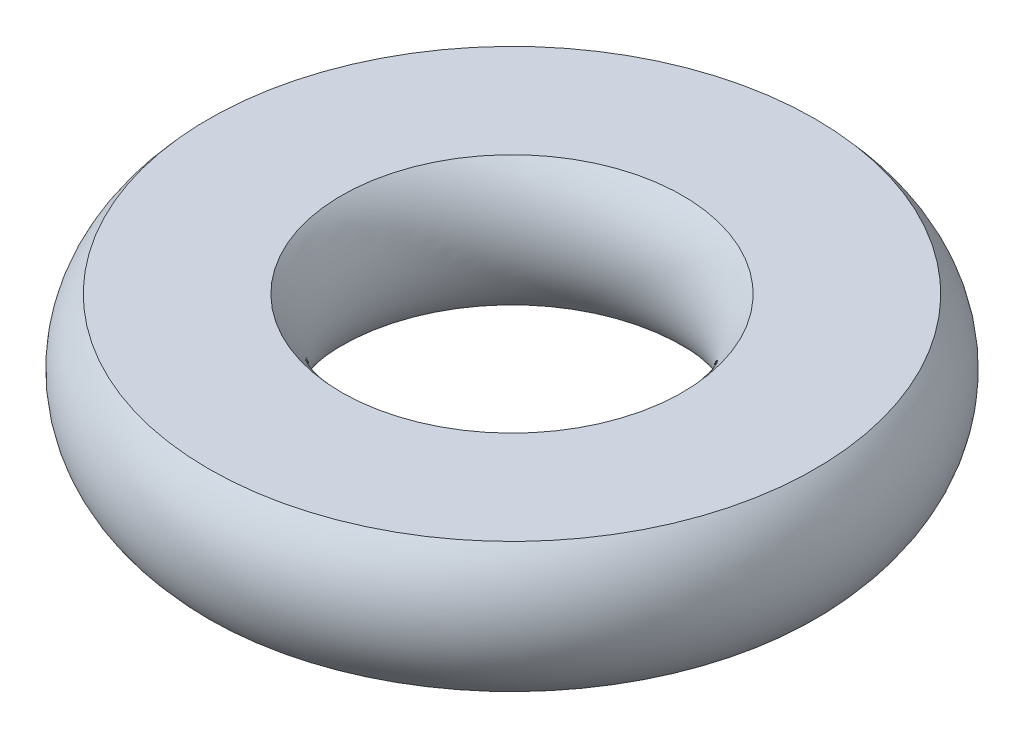
ISO-10303-21;
HEADER;
FILE_DESCRIPTION(('STEP AP214'),'2;1');
FILE_NAME('part.step','',(''),(''),'','','');
FILE_SCHEMA(('AUTOMOTIVE_DESIGN { 1 0 10303 214 1 1 1 1 }'));
ENDSEC;
DATA;
#1=APPLICATION_CONTEXT('core data for automotive mechanical design processes');
#2=APPLICATION_PROTOCOL_DEFINITION('international standard','automotive_design',2000,#1);
#3=PRODUCT_CONTEXT('',#1,'mechanical');
#4=PRODUCT('Part','Part','',(#3));
#5=PRODUCT_RELATED_PRODUCT_CATEGORY('part','',(#4));
#6=PRODUCT_DEFINITION_FORMATION('','',#4);
#7=PRODUCT_DEFINITION_CONTEXT('part definition',#1,'design');
#8=PRODUCT_DEFINITION('design','',#6,#7);
#9=PRODUCT_DEFINITION_SHAPE('','',#8);
#10=(LENGTH_UNIT() NAMED_UNIT(*) SI_UNIT(.MILLI.,.METRE.));
#11=(NAMED_UNIT(*) PLANE_ANGLE_UNIT() SI_UNIT($,.RADIAN.));
#12=(NAMED_UNIT(*) SI_UNIT($,.STERADIAN.) SOLID_ANGLE_UNIT());
#13=UNCERTAINTY_MEASURE_WITH_UNIT(LENGTH_MEASURE(1.E-05),#10,'distance_accuracy_value','');
#14=(GEOMETRIC_REPRESENTATION_CONTEXT(3) GLOBAL_UNCERTAINTY_ASSIGNED_CONTEXT((#13)) GLOBAL_UNIT_ASSIGNED_CONTEXT((#10,
#11,#12)) REPRESENTATION_CONTEXT('',''));
#15=CARTESIAN_POINT('',(0.,0.,0.));
#16=DIRECTION('',(0.,0.,1.));
#17=DIRECTION('',(1.,0.,0.));
#18=AXIS2_PLACEMENT_3D('',#15,#16,#17);
#19=CARTESIAN_POINT('',(0.,0.35,0.));
#20=DIRECTION('',(0.,1.,0.));
#21=DIRECTION('',(0.,0.,1.));
#22=AXIS2_PLACEMENT_3D('',#19,#20,#21);
#23=PLANE('',#22);
#24=CARTESIAN_POINT('',(0.,0.35,0.));
#25=DIRECTION('',(0.,1.,0.));
#26=DIRECTION('',(0.,0.,1.));
#27=AXIS2_PLACEMENT_3D('',#24,#25,#26);
#28=CIRCLE('',#27,1.63207142142714);
#29=CARTESIAN_POINT('',(0.,0.35,1.63207142142714));
#30=VERTEX_POINT('',#29);
#31=EDGE_CURVE('E62',#30,#30,#28,.T.);
#32=ORIENTED_EDGE('',*,*,#31,.T.);
#33=EDGE_LOOP('',(#32));
#34=FACE_BOUND('',#33,.T.);
#35=CARTESIAN_POINT('',(0.,0.35,0.));
#36=DIRECTION('',(0.,1.,0.));
#37=DIRECTION('',(0.,0.,1.));
#38=AXIS2_PLACEMENT_3D('',#35,#36,#37);
#39=CIRCLE('',#38,0.917928578572857);
#40=CARTESIAN_POINT('',(0.,0.35,0.917928578572857));
#41=VERTEX_POINT('',#40);
#42=EDGE_CURVE('E10',#41,#41,#39,.T.);
#43=ORIENTED_EDGE('',*,*,#42,.F.);
#44=EDGE_LOOP('',(#43));
#45=FACE_BOUND('',#44,.T.);
#46=ADVANCED_FACE('F45',(#34,#45),#23,.T.);
#47=CARTESIAN_POINT('',(0.,0.,0.));
#48=DIRECTION('',(0.,1.,0.));
#49=DIRECTION('',(0.,0.,1.));
#50=AXIS2_PLACEMENT_3D('',#47,#48,#49);
#51=TOROIDAL_SURFACE('',#50,1.275,0.5);
#52=CARTESIAN_POINT('',(0.,-0.35,0.));
#53=DIRECTION('',(0.,1.,0.));
#54=DIRECTION('',(0.,0.,1.));
#55=AXIS2_PLACEMENT_3D('',#52,#53,#54);
#56=CIRCLE('',#55,0.917928578572857);
#57=CARTESIAN_POINT('',(0.,-0.35,0.917928578572857));
#58=VERTEX_POINT('',#57);
#59=EDGE_CURVE('E52',#58,#58,#56,.T.);
#60=ORIENTED_EDGE('',*,*,#59,.F.);
#61=EDGE_LOOP('',(#60));
#62=FACE_BOUND('',#61,.T.);
#63=ORIENTED_EDGE('',*,*,#42,.T.);
#64=EDGE_LOOP('',(#63));
#65=FACE_BOUND('',#64,.T.);
#66=ADVANCED_FACE('F76',(#62,#65),#51,.T.);
#67=CARTESIAN_POINT('',(0.,-0.35,0.));
#68=DIRECTION('',(0.,1.,0.));
#69=DIRECTION('',(0.,0.,1.));
#70=AXIS2_PLACEMENT_3D('',#67,#68,#69);
#71=PLANE('',#70);
#72=CARTESIAN_POINT('',(0.,-0.35,0.));
#73=DIRECTION('',(0.,1.,0.));
#74=DIRECTION('',(0.,0.,1.));
#75=AXIS2_PLACEMENT_3D('',#72,#73,#74);
#76=CIRCLE('',#75,1.63207142142714);
#77=CARTESIAN_POINT('',(0.,-0.35,1.63207142142714));
#78=VERTEX_POINT('',#77);
#79=EDGE_CURVE('E57',#78,#78,#76,.T.);
#80=ORIENTED_EDGE('',*,*,#79,.F.);
#81=EDGE_LOOP('',(#80));
#82=FACE_BOUND('',#81,.T.);
#83=ORIENTED_EDGE('',*,*,#59,.T.);
#84=EDGE_LOOP('',(#83));
#85=FACE_BOUND('',#84,.T.);
#86=ADVANCED_FACE('F74',(#82,#85),#71,.F.);
#87=ORIENTED_EDGE('',*,*,#31,.F.);
#88=EDGE_LOOP('',(#87));
#89=FACE_BOUND('',#88,.T.);
#90=ORIENTED_EDGE('',*,*,#79,.T.);
#91=EDGE_LOOP('',(#90));
#92=FACE_BOUND('',#91,.T.);
#93=ADVANCED_FACE('F71',(#89,#92),#51,.T.);
#94=CLOSED_SHELL('',(#46,#66,#86,#93));
#95=MANIFOLD_SOLID_BREP('B2',#94);
#96=ADVANCED_BREP_SHAPE_REPRESENTATION('',(#18,#95),#14);
#97=SHAPE_DEFINITION_REPRESENTATION(#9,#96);
ENDSEC;
END-ISO-10303-21;
